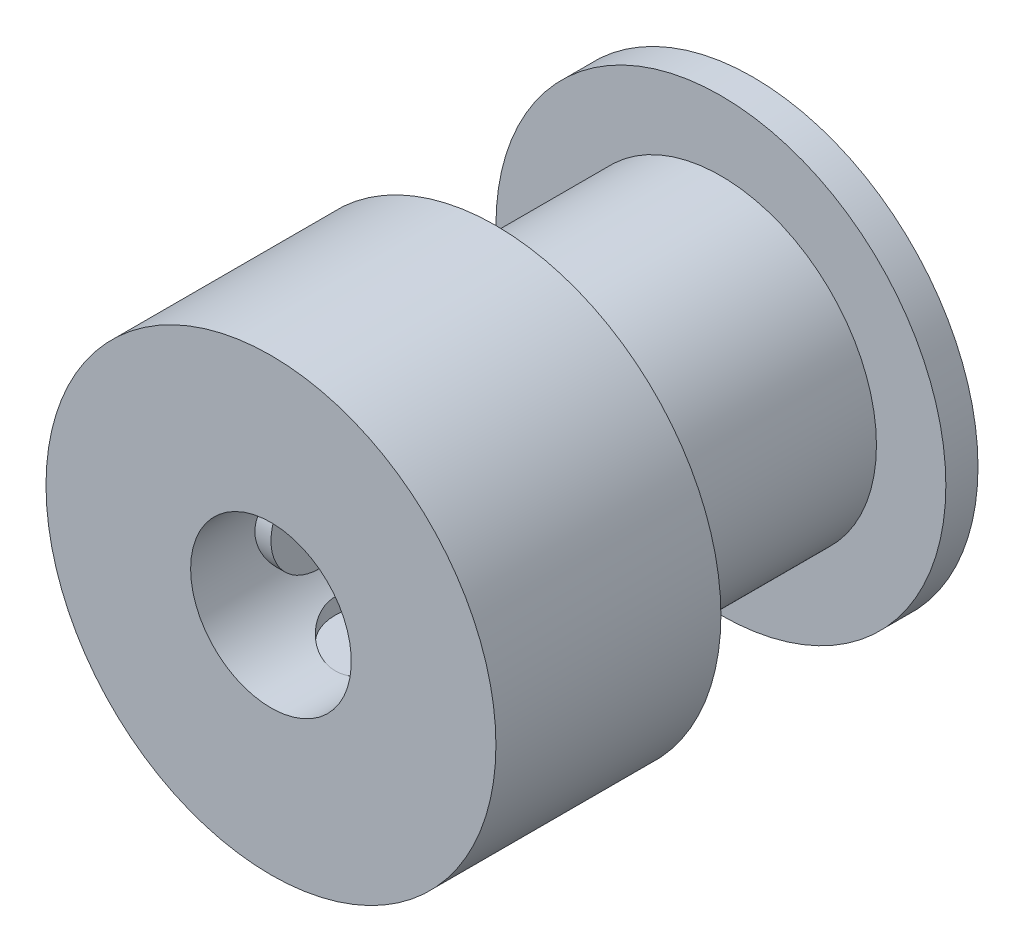
ISO-10303-21;
HEADER;
FILE_DESCRIPTION(('STEP AP214'),'2;1');
FILE_NAME('part.step','',(''),(''),'','','');
FILE_SCHEMA(('AUTOMOTIVE_DESIGN { 1 0 10303 214 1 1 1 1 }'));
ENDSEC;
DATA;
#1=APPLICATION_CONTEXT('core data for automotive mechanical design processes');
#2=APPLICATION_PROTOCOL_DEFINITION('international standard','automotive_design',2000,#1);
#3=PRODUCT_CONTEXT('',#1,'mechanical');
#4=PRODUCT('Part','Part','',(#3));
#5=PRODUCT_RELATED_PRODUCT_CATEGORY('part','',(#4));
#6=PRODUCT_DEFINITION_FORMATION('','',#4);
#7=PRODUCT_DEFINITION_CONTEXT('part definition',#1,'design');
#8=PRODUCT_DEFINITION('design','',#6,#7);
#9=PRODUCT_DEFINITION_SHAPE('','',#8);
#10=(LENGTH_UNIT() NAMED_UNIT(*) SI_UNIT(.MILLI.,.METRE.));
#11=(NAMED_UNIT(*) PLANE_ANGLE_UNIT() SI_UNIT($,.RADIAN.));
#12=(NAMED_UNIT(*) SI_UNIT($,.STERADIAN.) SOLID_ANGLE_UNIT());
#13=UNCERTAINTY_MEASURE_WITH_UNIT(LENGTH_MEASURE(1.E-05),#10,'distance_accuracy_value','');
#14=(GEOMETRIC_REPRESENTATION_CONTEXT(3) GLOBAL_UNCERTAINTY_ASSIGNED_CONTEXT((#13)) GLOBAL_UNIT_ASSIGNED_CONTEXT((#10,
#11,#12)) REPRESENTATION_CONTEXT('',''));
#15=CARTESIAN_POINT('',(0.,0.,0.));
#16=DIRECTION('',(0.,0.,1.));
#17=DIRECTION('',(1.,0.,0.));
#18=AXIS2_PLACEMENT_3D('',#15,#16,#17);
#19=CARTESIAN_POINT('',(-2.,0.,10.5));
#20=DIRECTION('',(1.,0.,0.));
#21=DIRECTION('',(0.,0.,-1.));
#22=AXIS2_PLACEMENT_3D('',#19,#20,#21);
#23=PLANE('',#22);
#24=CARTESIAN_POINT('',(-2.,0.,10.5));
#25=DIRECTION('',(-1.,0.,0.));
#26=DIRECTION('',(0.,0.,1.));
#27=AXIS2_PLACEMENT_3D('',#24,#25,#26);
#28=CIRCLE('',#27,1.5);
#29=CARTESIAN_POINT('',(-2.,1.5,10.5));
#30=VERTEX_POINT('',#29);
#31=CARTESIAN_POINT('',(-2.,-1.5,10.5));
#32=VERTEX_POINT('',#31);
#33=EDGE_CURVE('E51',#30,#32,#28,.T.);
#34=ORIENTED_EDGE('',*,*,#33,.F.);
#35=CARTESIAN_POINT('',(-2.,0.,10.5));
#36=DIRECTION('',(-1.,0.,0.));
#37=DIRECTION('',(0.,0.,1.));
#38=AXIS2_PLACEMENT_3D('',#35,#36,#37);
#39=CIRCLE('',#38,1.5);
#40=EDGE_CURVE('E42',#32,#30,#39,.T.);
#41=ORIENTED_EDGE('',*,*,#40,.F.);
#42=EDGE_LOOP('',(#34,#41));
#43=FACE_BOUND('',#42,.T.);
#44=ADVANCED_FACE('F16',(#43),#23,.T.);
#45=CARTESIAN_POINT('',(0.,-2.5,10.5));
#46=DIRECTION('',(0.,1.,0.));
#47=DIRECTION('',(0.,0.,1.));
#48=AXIS2_PLACEMENT_3D('',#45,#46,#47);
#49=PLANE('',#48);
#50=CARTESIAN_POINT('',(0.,-2.5,10.5));
#51=DIRECTION('',(0.,-1.,0.));
#52=DIRECTION('',(0.,0.,-1.));
#53=AXIS2_PLACEMENT_3D('',#50,#51,#52);
#54=CIRCLE('',#53,1.5);
#55=CARTESIAN_POINT('',(0.,-2.5,9.));
#56=VERTEX_POINT('',#55);
#57=CARTESIAN_POINT('',(0.,-2.5,12.));
#58=VERTEX_POINT('',#57);
#59=EDGE_CURVE('E67',#56,#58,#54,.F.);
#60=ORIENTED_EDGE('',*,*,#59,.T.);
#61=CARTESIAN_POINT('',(0.,-2.5,10.5));
#62=DIRECTION('',(0.,-1.,0.));
#63=DIRECTION('',(0.,0.,-1.));
#64=AXIS2_PLACEMENT_3D('',#61,#62,#63);
#65=CIRCLE('',#64,1.5);
#66=EDGE_CURVE('E33',#58,#56,#65,.F.);
#67=ORIENTED_EDGE('',*,*,#66,.T.);
#68=EDGE_LOOP('',(#60,#67));
#69=FACE_BOUND('',#68,.T.);
#70=ADVANCED_FACE('F184',(#69),#49,.T.);
#71=CARTESIAN_POINT('',(0.,0.,0.));
#72=DIRECTION('',(0.,0.,-1.));
#73=DIRECTION('',(-1.,0.,0.));
#74=AXIS2_PLACEMENT_3D('',#71,#72,#73);
#75=CYLINDRICAL_SURFACE('',#74,7.);
#76=CARTESIAN_POINT('',(0.,0.,0.));
#77=DIRECTION('',(0.,0.,-1.));
#78=DIRECTION('',(-1.,0.,0.));
#79=AXIS2_PLACEMENT_3D('',#76,#77,#78);
#80=CIRCLE('',#79,7.);
#81=CARTESIAN_POINT('',(-7.,0.,0.));
#82=VERTEX_POINT('',#81);
#83=EDGE_CURVE('E69',#82,#82,#80,.F.);
#84=ORIENTED_EDGE('',*,*,#83,.F.);
#85=EDGE_LOOP('',(#84));
#86=FACE_BOUND('',#85,.T.);
#87=CARTESIAN_POINT('',(0.,0.,-1.));
#88=DIRECTION('',(0.,0.,-1.));
#89=DIRECTION('',(-1.,0.,0.));
#90=AXIS2_PLACEMENT_3D('',#87,#88,#89);
#91=CIRCLE('',#90,7.);
#92=CARTESIAN_POINT('',(-7.,0.,-1.));
#93=VERTEX_POINT('',#92);
#94=EDGE_CURVE('E19',#93,#93,#91,.F.);
#95=ORIENTED_EDGE('',*,*,#94,.T.);
#96=EDGE_LOOP('',(#95));
#97=FACE_BOUND('',#96,.T.);
#98=ADVANCED_FACE('F190',(#86,#97),#75,.T.);
#99=CARTESIAN_POINT('',(0.,0.,-1.));
#100=DIRECTION('',(0.,0.,1.));
#101=DIRECTION('',(1.,0.,0.));
#102=AXIS2_PLACEMENT_3D('',#99,#100,#101);
#103=PLANE('',#102);
#104=CARTESIAN_POINT('',(0.,0.,-1.));
#105=DIRECTION('',(0.,0.,-1.));
#106=DIRECTION('',(-1.,0.,0.));
#107=AXIS2_PLACEMENT_3D('',#104,#105,#106);
#108=CIRCLE('',#107,2.5);
#109=CARTESIAN_POINT('',(-2.5,0.,-1.));
#110=VERTEX_POINT('',#109);
#111=EDGE_CURVE('E59',#110,#110,#108,.F.);
#112=ORIENTED_EDGE('',*,*,#111,.T.);
#113=EDGE_LOOP('',(#112));
#114=FACE_BOUND('',#113,.T.);
#115=ORIENTED_EDGE('',*,*,#94,.F.);
#116=EDGE_LOOP('',(#115));
#117=FACE_BOUND('',#116,.T.);
#118=ADVANCED_FACE('F124',(#114,#117),#103,.F.);
#119=CARTESIAN_POINT('',(-2.,0.,10.5));
#120=DIRECTION('',(-1.,0.,0.));
#121=DIRECTION('',(0.,0.,1.));
#122=AXIS2_PLACEMENT_3D('',#119,#120,#121);
#123=CYLINDRICAL_SURFACE('',#122,1.5);
#124=ORIENTED_EDGE('',*,*,#40,.T.);
#125=CARTESIAN_POINT('',(-2.,1.5,10.5));
#126=CARTESIAN_POINT('',(-1.99998845125754,1.50000446667744,10.5379460039268));
#127=CARTESIAN_POINT('',(-2.00108119692007,1.49855919883946,10.5758677773118));
#128=CARTESIAN_POINT('',(-2.00536653048947,1.49282452671711,10.6513400826957));
#129=CARTESIAN_POINT('',(-2.00855707146071,1.48853789487668,10.6888909404004));
#130=CARTESIAN_POINT('',(-2.021041861003,1.47159501359917,10.7999561422818));
#131=CARTESIAN_POINT('',(-2.03325318506055,1.45485351717748,10.8725638438879));
#132=CARTESIAN_POINT('',(-2.06360790212355,1.41145584078444,11.0130266902596));
#133=CARTESIAN_POINT('',(-2.08173054369951,1.38483429988201,11.0808974663382));
#134=CARTESIAN_POINT('',(-2.12181561260657,1.32259985689998,11.2113100693901));
#135=CARTESIAN_POINT('',(-2.1437866991849,1.28696659587043,11.2738393954242));
#136=CARTESIAN_POINT('',(-2.192290190828,1.20270550742176,11.3999612476482));
#137=CARTESIAN_POINT('',(-2.21905257384834,1.15302554256959,11.4627620757373));
#138=CARTESIAN_POINT('',(-2.27227107730584,1.0442481916894,11.5797824496055));
#139=CARTESIAN_POINT('',(-2.29872706388119,0.98514684454674,11.6339983667583));
#140=CARTESIAN_POINT('',(-2.3517610005987,0.85142993599944,11.7381442725309));
#141=CARTESIAN_POINT('',(-2.37804133446304,0.775827124792299,11.7869727006281));
#142=CARTESIAN_POINT('',(-2.42444579119999,0.615617265743277,11.870823864095));
#143=CARTESIAN_POINT('',(-2.44457789911104,0.531022091045724,11.9058645236135));
#144=CARTESIAN_POINT('',(-2.47318791582301,0.372230873686335,11.9549816818827));
#145=CARTESIAN_POINT('',(-2.48315914915458,0.299144772998754,11.9717874821598));
#146=CARTESIAN_POINT('',(-2.49656321721301,0.150705389453477,11.9942932386834));
#147=CARTESIAN_POINT('',(-2.50000002526346,0.0753535126602901,11.9999999438957));
#148=CARTESIAN_POINT('',(-2.49999997422529,-0.0768784187058445,12.0000000572397));
#149=CARTESIAN_POINT('',(-2.49642260737716,-0.153758540157806,11.9940601609289));
#150=CARTESIAN_POINT('',(-2.48247690155861,-0.3051092913513,11.9706388656357));
#151=CARTESIAN_POINT('',(-2.47210567311113,-0.379578881728542,11.9531525558571));
#152=CARTESIAN_POINT('',(-2.44561848130593,-0.523742310889763,11.9076184726104));
#153=CARTESIAN_POINT('',(-2.4295262454606,-0.593454478249208,11.8796142946455));
#154=CARTESIAN_POINT('',(-2.39296178151658,-0.7270034849347,11.8141545835679));
#155=CARTESIAN_POINT('',(-2.37248889496281,-0.790839438942532,11.7766976294575));
#156=CARTESIAN_POINT('',(-2.32705598928082,-0.916293178478416,11.6902295623077));
#157=CARTESIAN_POINT('',(-2.30187299625839,-0.977371899925503,11.6405558174714));
#158=CARTESIAN_POINT('',(-2.25030967943651,-1.09087201913285,11.5325449898214));
#159=CARTESIAN_POINT('',(-2.22392762543903,-1.14328036546564,11.4741950931026));
#160=CARTESIAN_POINT('',(-2.16908607213643,-1.24449562751425,11.3420151528547));
#161=CARTESIAN_POINT('',(-2.14077220513037,-1.29205912552267,11.2671633239585));
#162=CARTESIAN_POINT('',(-2.08934323302114,-1.37367216768323,11.1090186561716));
#163=CARTESIAN_POINT('',(-2.06621114513034,-1.40776614604833,11.0257547288919));
#164=CARTESIAN_POINT('',(-2.03267374057175,-1.45565431453618,10.8693086875281));
#165=CARTESIAN_POINT('',(-2.02067077842903,-1.47210209140112,10.7972999951129));
#166=CARTESIAN_POINT('',(-2.00840393817101,-1.48874396466246,10.6871882329893));
#167=CARTESIAN_POINT('',(-2.00527035572197,-1.49295348428562,10.6499743095207));
#168=CARTESIAN_POINT('',(-2.00106149599344,-1.49858543052732,10.5751810330064));
#169=CARTESIAN_POINT('',(-1.99998845565003,-1.50000482821327,10.5376013272806));
#170=CARTESIAN_POINT('',(-2.,-1.5,10.5));
#171=B_SPLINE_CURVE_WITH_KNOTS('',3,(#125,#126,#127,#128,#129,#130,#131,#132,#133,#134,#135,
#136,#137,#138,#139,#140,#141,#142,#143,#144,#145,#146,#147,#148,#149,#150,#151,#152,#153,#154,
#155,#156,#157,#158,#159,#160,#161,#162,#163,#164,#165,#166,#167,#168,#169,#170),.UNSPECIFIED.,
.F.,.F.,(4,2,2,2,2,2,2,2,2,2,2,2,2,2,2,2,2,2,2,2,2,2,4),(0.,0.113749743967779,0.227388660366983,
0.452655846808962,0.677140603024991,0.902137109468504,1.1544356933506,1.40684063448354,
1.68660467371304,1.96600380749074,2.1919096879361,2.41767816003353,2.64801543981945,
2.87845074732742,3.10794127960443,3.33746633083744,3.58446927615064,3.83184071452131,
4.10975199652156,4.3867386726253,4.61004515803665,4.7226449405358,4.83536689303875),.UNSPECIFIED.);
#172=EDGE_CURVE('E54',#30,#32,#171,.T.);
#173=ORIENTED_EDGE('',*,*,#172,.T.);
#174=EDGE_LOOP('',(#124,#173));
#175=FACE_BOUND('',#174,.T.);
#176=ADVANCED_FACE('F62',(#175),#123,.T.);
#177=CARTESIAN_POINT('',(-2.,0.,10.5));
#178=DIRECTION('',(-1.,0.,0.));
#179=DIRECTION('',(0.,0.,1.));
#180=AXIS2_PLACEMENT_3D('',#177,#178,#179);
#181=CYLINDRICAL_SURFACE('',#180,1.5);
#182=ORIENTED_EDGE('',*,*,#33,.T.);
#183=CARTESIAN_POINT('',(-2.,-1.5,10.5));
#184=CARTESIAN_POINT('',(-1.99998845125754,-1.50000446667744,10.4620539960732));
#185=CARTESIAN_POINT('',(-2.00108119692007,-1.49855919883946,10.4241322226882));
#186=CARTESIAN_POINT('',(-2.00536653048948,-1.49282452671711,10.3486599173043));
#187=CARTESIAN_POINT('',(-2.00855707146071,-1.48853789487668,10.3111090595996));
#188=CARTESIAN_POINT('',(-2.021041861003,-1.47159501359917,10.2000438577182));
#189=CARTESIAN_POINT('',(-2.03325318506055,-1.45485351717748,10.1274361561121));
#190=CARTESIAN_POINT('',(-2.06360790212355,-1.41145584078444,9.98697330974039));
#191=CARTESIAN_POINT('',(-2.08173054369951,-1.38483429988201,9.91910253366179));
#192=CARTESIAN_POINT('',(-2.12181561260657,-1.32259985689998,9.78868993060992));
#193=CARTESIAN_POINT('',(-2.14378669918491,-1.28696659587042,9.72616060457585));
#194=CARTESIAN_POINT('',(-2.192290190828,-1.20270550742175,9.60003875235176));
#195=CARTESIAN_POINT('',(-2.21905257384835,-1.15302554256959,9.53723792426272));
#196=CARTESIAN_POINT('',(-2.27227107730584,-1.0442481916894,9.42021755039451));
#197=CARTESIAN_POINT('',(-2.29872706388119,-0.985146844546733,9.36600163324166));
#198=CARTESIAN_POINT('',(-2.3517610005987,-0.851429935999432,9.26185572746905));
#199=CARTESIAN_POINT('',(-2.37804133446305,-0.775827124792291,9.21302729937186));
#200=CARTESIAN_POINT('',(-2.42444579119999,-0.615617265743269,9.12917613590496));
#201=CARTESIAN_POINT('',(-2.44457789911104,-0.531022091045715,9.09413547638651));
#202=CARTESIAN_POINT('',(-2.47318791582301,-0.372230873686328,9.04501831811731));
#203=CARTESIAN_POINT('',(-2.48315914915458,-0.299144772998749,9.02821251784016));
#204=CARTESIAN_POINT('',(-2.49656321721301,-0.150705389453474,9.00570676131658));
#205=CARTESIAN_POINT('',(-2.50000002526346,-0.0753535126602886,9.00000005610433));
#206=CARTESIAN_POINT('',(-2.49999997422529,0.0768784187058447,8.9999999427603));
#207=CARTESIAN_POINT('',(-2.49642260737716,0.153758540157806,9.00593983907108));
#208=CARTESIAN_POINT('',(-2.48247690155861,0.3051092913513,9.02936113436433));
#209=CARTESIAN_POINT('',(-2.47210567311113,0.379578881728543,9.04684744414288));
#210=CARTESIAN_POINT('',(-2.44561848130593,0.523742310889763,9.09238152738961));
#211=CARTESIAN_POINT('',(-2.4295262454606,0.593454478249208,9.1203857053545));
#212=CARTESIAN_POINT('',(-2.39296178151658,0.727003484934701,9.18584541643214));
#213=CARTESIAN_POINT('',(-2.37248889496281,0.790839438942532,9.22330237054254));
#214=CARTESIAN_POINT('',(-2.32705598928082,0.916293178478416,9.30977043769226));
#215=CARTESIAN_POINT('',(-2.30187299625839,0.977371899925503,9.35944418252859));
#216=CARTESIAN_POINT('',(-2.25030967943651,1.09087201913285,9.4674550101786));
#217=CARTESIAN_POINT('',(-2.22392762543903,1.14328036546564,9.52580490689743));
#218=CARTESIAN_POINT('',(-2.16908607213643,1.24449562751425,9.65798484714533));
#219=CARTESIAN_POINT('',(-2.14077220513037,1.29205912552267,9.73283667604147));
#220=CARTESIAN_POINT('',(-2.08934323302114,1.37367216768323,9.89098134382835));
#221=CARTESIAN_POINT('',(-2.06621114513034,1.40776614604833,9.97424527110812));
#222=CARTESIAN_POINT('',(-2.03267374057175,1.45565431453618,10.1306913124719));
#223=CARTESIAN_POINT('',(-2.02067077842902,1.47210209140112,10.2027000048871));
#224=CARTESIAN_POINT('',(-2.008403938171,1.48874396466246,10.3128117670107));
#225=CARTESIAN_POINT('',(-2.00527035572197,1.49295348428562,10.3500256904793));
#226=CARTESIAN_POINT('',(-2.00106149599343,1.49858543052732,10.4248189669936));
#227=CARTESIAN_POINT('',(-1.99998845565003,1.50000482821327,10.4623986727194));
#228=CARTESIAN_POINT('',(-2.,1.5,10.5));
#229=B_SPLINE_CURVE_WITH_KNOTS('',3,(#183,#184,#185,#186,#187,#188,#189,#190,#191,#192,#193,
#194,#195,#196,#197,#198,#199,#200,#201,#202,#203,#204,#205,#206,#207,#208,#209,#210,#211,#212,
#213,#214,#215,#216,#217,#218,#219,#220,#221,#222,#223,#224,#225,#226,#227,#228),.UNSPECIFIED.,
.F.,.F.,(4,2,2,2,2,2,2,2,2,2,2,2,2,2,2,2,2,2,2,2,2,2,4),(0.,0.113749743967779,0.227388660366983,
0.452655846808964,0.677140603024995,0.902137109468504,1.1544356933506,1.40684063448355,
1.68660467371305,1.96600380749074,2.1919096879361,2.41767816003353,2.64801543981945,
2.87845074732741,3.10794127960442,3.33746633083743,3.58446927615064,3.8318407145213,
4.10975199652156,4.3867386726253,4.61004515803664,4.72264494053579,4.83536689303875),.UNSPECIFIED.);
#230=EDGE_CURVE('E48',#32,#30,#229,.T.);
#231=ORIENTED_EDGE('',*,*,#230,.T.);
#232=EDGE_LOOP('',(#182,#231));
#233=FACE_BOUND('',#232,.T.);
#234=ADVANCED_FACE('F50',(#233),#181,.T.);
#235=CARTESIAN_POINT('',(0.,0.,10.5));
#236=DIRECTION('',(0.,-1.,0.));
#237=DIRECTION('',(0.,0.,-1.));
#238=AXIS2_PLACEMENT_3D('',#235,#236,#237);
#239=CYLINDRICAL_SURFACE('',#238,1.5);
#240=CARTESIAN_POINT('',(0.,-2.5,12.));
#241=CARTESIAN_POINT('',(0.0385814004818395,-2.50000443930784,12.0000027845304));
#242=CARTESIAN_POINT('',(0.0771415674825014,-2.49910594610235,11.9985104087853));
#243=CARTESIAN_POINT('',(0.153933720325979,-2.49555162123921,11.9925770543666));
#244=CARTESIAN_POINT('',(0.192165861924006,-2.49289667640063,11.9881375636652));
#245=CARTESIAN_POINT('',(0.305515608465147,-2.48241334520944,11.9705339725033));
#246=CARTESIAN_POINT('',(0.379786208449342,-2.47206515182342,11.9530835051044));
#247=CARTESIAN_POINT('',(0.523717422888231,-2.4456254792361,11.9076298943821));
#248=CARTESIAN_POINT('',(0.593385129935151,-2.42954309263498,11.8796434538469));
#249=CARTESIAN_POINT('',(0.726933408093366,-2.3929831093628,11.8141937663116));
#250=CARTESIAN_POINT('',(0.790806982564217,-2.37250029690152,11.7767192636934));
#251=CARTESIAN_POINT('',(0.916306643350074,-2.32705149177753,11.6902210736182));
#252=CARTESIAN_POINT('',(0.977395457980456,-2.30186337045005,11.6405373135232));
#253=CARTESIAN_POINT('',(1.09089176245313,-2.25029963049995,11.5325222779886));
#254=CARTESIAN_POINT('',(1.1432895329452,-2.22392272378701,11.4741814574582));
#255=CARTESIAN_POINT('',(1.24445033696731,-2.16911053833429,11.3420761668166));
#256=CARTESIAN_POINT('',(1.29197814210969,-2.14081991172111,11.2672975272364));
#257=CARTESIAN_POINT('',(1.37361466763903,-2.08938279472069,11.1091526412274));
#258=CARTESIAN_POINT('',(1.40774529078447,-2.06622793517034,11.0258006951094));
#259=CARTESIAN_POINT('',(1.45440588845967,-2.03354639077354,10.873403988671));
#260=CARTESIAN_POINT('',(1.47016176402116,-2.02207898388904,10.8057649058051));
#261=CARTESIAN_POINT('',(1.49216163757828,-2.00590314688703,10.6681972185815));
#262=CARTESIAN_POINT('',(1.49841733576744,-2.00118640322559,10.5982715389981));
#263=CARTESIAN_POINT('',(1.50105509186428,-1.99920922227166,10.457988351739));
#264=CARTESIAN_POINT('',(1.49741781983876,-2.0019633823942,10.3876302670482));
#265=CARTESIAN_POINT('',(1.48046054476459,-2.01453265724005,10.2487209243655));
#266=CARTESIAN_POINT('',(1.46713330077918,-2.0243530522272,10.1801710573029));
#267=CARTESIAN_POINT('',(1.43173915740478,-2.04953191748151,10.0474695044733));
#268=CARTESIAN_POINT('',(1.40978734105081,-2.06481723350102,9.9832724537562));
#269=CARTESIAN_POINT('',(1.35795036175845,-2.09927066338523,9.85930454120239));
#270=CARTESIAN_POINT('',(1.32806235171397,-2.11844017011581,9.79953527769404));
#271=CARTESIAN_POINT('',(1.25518104106243,-2.16255259931458,9.67501780611045));
#272=CARTESIAN_POINT('',(1.21081016017397,-2.1879189881197,9.61122555972334));
#273=CARTESIAN_POINT('',(1.11291350322468,-2.23930456094727,9.49132658913887));
#274=CARTESIAN_POINT('',(1.05937846722628,-2.26532438231465,9.43522774304631));
#275=CARTESIAN_POINT('',(0.935803921168373,-2.31935920842897,9.32437859536777));
#276=CARTESIAN_POINT('',(0.864503841812061,-2.34714618785512,9.27090811709965));
#277=CARTESIAN_POINT('',(0.712244675848714,-2.39773148732483,9.17686459052258));
#278=CARTESIAN_POINT('',(0.631293671068314,-2.42053393676571,9.13628085357353));
#279=CARTESIAN_POINT('',(0.478302472498103,-2.45481960299191,9.07640815930277));
#280=CARTESIAN_POINT('',(0.407574199222196,-2.46763989045195,9.0545169216726));
#281=CARTESIAN_POINT('',(0.262934036845264,-2.48719803445021,9.0213731562986));
#282=CARTESIAN_POINT('',(0.189030327299971,-2.49395063949223,9.01009482895284));
#283=CARTESIAN_POINT('',(0.0955848699627537,-2.4982460622018,9.00292517605478));
#284=CARTESIAN_POINT('',(0.0764812683724458,-2.49890352611496,9.0018282580862));
#285=CARTESIAN_POINT('',(0.0382541496932987,-2.49977987940585,9.0003665802204));
#286=CARTESIAN_POINT('',(0.0191306686226404,-2.49999918372609,9.00000112761591));
#287=CARTESIAN_POINT('',(0.,-2.5,9.));
#288=B_SPLINE_CURVE_WITH_KNOTS('',3,(#240,#241,#242,#243,#244,#245,#246,#247,#248,#249,#250,
#251,#252,#253,#254,#255,#256,#257,#258,#259,#260,#261,#262,#263,#264,#265,#266,#267,#268,#269,
#270,#271,#272,#273,#274,#275,#276,#277,#278,#279,#280,#281,#282,#283,#284,#285,#286,#287),
.UNSPECIFIED.,.F.,.F.,(4,2,2,2,2,2,2,2,2,2,2,2,2,2,2,2,2,2,2,2,2,2,2,4),(0.,0.115664120203099,
0.231269886993216,0.461003678278137,0.690374793435717,0.920019295308534,1.1670692627372,
1.4143936745253,1.69207052751252,1.96929150285475,2.17956799484947,2.38958530467528,
2.60001326320508,2.81059862813213,3.01846457428349,3.22640519324175,3.47069421075596,
3.71523154357855,3.99388188884002,4.27230050596577,4.49678090538653,4.72071418048355,
4.77814150578977,4.83551442088689),.UNSPECIFIED.);
#289=EDGE_CURVE('E53',#58,#56,#288,.T.);
#290=ORIENTED_EDGE('',*,*,#289,.T.);
#291=ORIENTED_EDGE('',*,*,#66,.F.);
#292=EDGE_LOOP('',(#290,#291));
#293=FACE_BOUND('',#292,.T.);
#294=ADVANCED_FACE('F112',(#293),#239,.F.);
#295=CARTESIAN_POINT('',(0.,0.,10.5));
#296=DIRECTION('',(0.,-1.,0.));
#297=DIRECTION('',(0.,0.,-1.));
#298=AXIS2_PLACEMENT_3D('',#295,#296,#297);
#299=CYLINDRICAL_SURFACE('',#298,1.5);
#300=CARTESIAN_POINT('',(0.,-2.5,9.));
#301=CARTESIAN_POINT('',(-0.0385813837962223,-2.50000443929168,8.99999721523212));
#302=CARTESIAN_POINT('',(-0.0771415341276934,-2.49910594687359,9.00148958980402));
#303=CARTESIAN_POINT('',(-0.153933653988488,-2.49555162508018,9.00742293934229));
#304=CARTESIAN_POINT('',(-0.192165779273228,-2.49289668252548,9.01186242633403));
#305=CARTESIAN_POINT('',(-0.305515543660832,-2.4824133541699,9.02946601180464));
#306=CARTESIAN_POINT('',(-0.379786176961611,-2.47206515751797,9.04691648247312));
#307=CARTESIAN_POINT('',(-0.523717183771282,-2.44562552325056,9.09237003257928));
#308=CARTESIAN_POINT('',(-0.593384666741939,-2.42954319986203,9.12035636948615));
#309=CARTESIAN_POINT('',(-0.726932980022347,-2.39298324615722,9.18580597349381));
#310=CARTESIAN_POINT('',(-0.790806774613754,-2.37250037091411,9.22328055904044));
#311=CARTESIAN_POINT('',(-0.916308038511827,-2.32705098792305,9.30977992448331));
#312=CARTESIAN_POINT('',(-0.977398091852476,-2.30186229088331,9.35946496676965));
#313=CARTESIAN_POINT('',(-1.090893982525,-2.25029850457702,9.46748006169127));
#314=CARTESIAN_POINT('',(-1.14329047376486,-2.22392217676002,9.52581929214197));
#315=CARTESIAN_POINT('',(-1.24444354364624,-2.1691142610035,9.6579154995646));
#316=CARTESIAN_POINT('',(-1.29196626366659,-2.1408271668036,9.73268581241023));
#317=CARTESIAN_POINT('',(-1.37360546118757,-2.08938882848929,9.8908231957338));
#318=CARTESIAN_POINT('',(-1.40774041421672,-2.06623052584855,9.97417821691156));
#319=CARTESIAN_POINT('',(-1.45575429980654,-2.03260261763291,10.1310041911241));
#320=CARTESIAN_POINT('',(-1.47225551749514,-2.02055502127791,10.2033261900206));
#321=CARTESIAN_POINT('',(-1.49437060305173,-2.0042591896918,10.3504345197357));
#322=CARTESIAN_POINT('',(-1.49999988711658,-1.99999991122979,10.4252172079751));
#323=CARTESIAN_POINT('',(-1.50000011391186,-2.00000008957896,10.5754641090421));
#324=CARTESIAN_POINT('',(-1.49426801901149,-2.00433751081761,10.6509283237693));
#325=CARTESIAN_POINT('',(-1.47175227371235,-2.02092317633736,10.799320108909));
#326=CARTESIAN_POINT('',(-1.45495605813505,-2.03318041460597,10.872244695889));
#327=CARTESIAN_POINT('',(-1.41143492667642,-2.06362357074115,11.0130817328375));
#328=CARTESIAN_POINT('',(-1.38478231401582,-2.08176619919683,11.0810264686901));
#329=CARTESIAN_POINT('',(-1.32253029758288,-2.12185824141449,11.2114356889974));
#330=CARTESIAN_POINT('',(-1.28692794273441,-2.14380891009333,11.2738983566185));
#331=CARTESIAN_POINT('',(-1.20271467347221,-2.19228495845041,11.3999462876053));
#332=CARTESIAN_POINT('',(-1.15304573264917,-2.2190415774584,11.4627359060435));
#333=CARTESIAN_POINT('',(-1.04427276281273,-2.27226017558418,11.5797604675685));
#334=CARTESIAN_POINT('',(-0.985160917119809,-2.29872189100128,11.6339882487119));
#335=CARTESIAN_POINT('',(-0.851396120389797,-2.35177395943889,11.7381696759581));
#336=CARTESIAN_POINT('',(-0.77575234996935,-2.37806573960125,11.7870182924309));
#337=CARTESIAN_POINT('',(-0.615542596594062,-2.4244646856954,11.8708565130722));
#338=CARTESIAN_POINT('',(-0.530996901072252,-2.4445855222223,11.9058768016189));
#339=CARTESIAN_POINT('',(-0.372427026232439,-2.47315008647313,11.954917389803));
#340=CARTESIAN_POINT('',(-0.299531645990906,-2.48309981307425,11.971689657388));
#341=CARTESIAN_POINT('',(-0.188352869739565,-2.49317576696373,11.9886047299581));
#342=CARTESIAN_POINT('',(-0.150874224877934,-2.49572659946414,11.9928694755803));
#343=CARTESIAN_POINT('',(-0.0756031337597444,-2.49914156814389,11.9985696443564));
#344=CARTESIAN_POINT('',(-0.0378105073089931,-2.50000465731207,12.0000033112231));
#345=CARTESIAN_POINT('',(0.,-2.5,12.));
#346=B_SPLINE_CURVE_WITH_KNOTS('',3,(#300,#301,#302,#303,#304,#305,#306,#307,#308,#309,#310,
#311,#312,#313,#314,#315,#316,#317,#318,#319,#320,#321,#322,#323,#324,#325,#326,#327,#328,#329,
#330,#331,#332,#333,#334,#335,#336,#337,#338,#339,#340,#341,#342,#343,#344,#345),.UNSPECIFIED.,
.F.,.F.,(4,2,2,2,2,2,2,2,2,2,2,2,2,2,2,2,2,2,2,2,2,2,4),(0.,0.115664070226622,0.231269786914254,
0.4610036780022,0.690374029801941,0.920019295244452,1.16707453371946,1.41439367395422,
1.69203483457204,1.96929148222114,2.19364345424009,2.41767706514676,2.64375175940176,
2.87008364333738,3.09478714246972,3.31956483244903,3.57181164511697,3.82426835594318,
4.10416227812526,4.38343159161057,4.60867322251853,4.72196326217573,4.83532356035488),.UNSPECIFIED.);
#347=EDGE_CURVE('E101',#56,#58,#346,.T.);
#348=ORIENTED_EDGE('',*,*,#347,.T.);
#349=ORIENTED_EDGE('',*,*,#59,.F.);
#350=EDGE_LOOP('',(#348,#349));
#351=FACE_BOUND('',#350,.T.);
#352=ADVANCED_FACE('F115',(#351),#299,.F.);
#353=CARTESIAN_POINT('',(0.,0.,0.));
#354=DIRECTION('',(0.,0.,1.));
#355=DIRECTION('',(1.,0.,0.));
#356=AXIS2_PLACEMENT_3D('',#353,#354,#355);
#357=PLANE('',#356);
#358=CARTESIAN_POINT('',(0.,0.,0.));
#359=DIRECTION('',(0.,0.,1.));
#360=DIRECTION('',(1.,0.,0.));
#361=AXIS2_PLACEMENT_3D('',#358,#359,#360);
#362=CIRCLE('',#361,4.84);
#363=CARTESIAN_POINT('',(4.84,0.,0.));
#364=VERTEX_POINT('',#363);
#365=EDGE_CURVE('E174',#364,#364,#362,.T.);
#366=ORIENTED_EDGE('',*,*,#365,.F.);
#367=EDGE_LOOP('',(#366));
#368=FACE_BOUND('',#367,.T.);
#369=ORIENTED_EDGE('',*,*,#83,.T.);
#370=EDGE_LOOP('',(#369));
#371=FACE_BOUND('',#370,.T.);
#372=ADVANCED_FACE('F94',(#368,#371),#357,.T.);
#373=CARTESIAN_POINT('',(0.,0.,0.));
#374=DIRECTION('',(0.,0.,-1.));
#375=DIRECTION('',(-1.,0.,0.));
#376=AXIS2_PLACEMENT_3D('',#373,#374,#375);
#377=CYLINDRICAL_SURFACE('',#376,2.5);
#378=ORIENTED_EDGE('',*,*,#172,.F.);
#379=ORIENTED_EDGE('',*,*,#230,.F.);
#380=EDGE_LOOP('',(#378,#379));
#381=FACE_BOUND('',#380,.T.);
#382=CARTESIAN_POINT('',(0.,0.,14.));
#383=DIRECTION('',(0.,0.,-1.));
#384=DIRECTION('',(-1.,0.,0.));
#385=AXIS2_PLACEMENT_3D('',#382,#383,#384);
#386=CIRCLE('',#385,2.5);
#387=CARTESIAN_POINT('',(-2.5,0.,14.));
#388=VERTEX_POINT('',#387);
#389=EDGE_CURVE('E172',#388,#388,#386,.T.);
#390=ORIENTED_EDGE('',*,*,#389,.F.);
#391=EDGE_LOOP('',(#390));
#392=FACE_BOUND('',#391,.T.);
#393=ORIENTED_EDGE('',*,*,#289,.F.);
#394=ORIENTED_EDGE('',*,*,#347,.F.);
#395=EDGE_LOOP('',(#393,#394));
#396=FACE_BOUND('',#395,.T.);
#397=ORIENTED_EDGE('',*,*,#111,.F.);
#398=EDGE_LOOP('',(#397));
#399=FACE_BOUND('',#398,.T.);
#400=ADVANCED_FACE('F56',(#381,#392,#396,#399),#377,.F.);
#401=CARTESIAN_POINT('',(0.,0.,0.));
#402=DIRECTION('',(0.,0.,1.));
#403=DIRECTION('',(1.,0.,0.));
#404=AXIS2_PLACEMENT_3D('',#401,#402,#403);
#405=CYLINDRICAL_SURFACE('',#404,4.84);
#406=ORIENTED_EDGE('',*,*,#365,.T.);
#407=EDGE_LOOP('',(#406));
#408=FACE_BOUND('',#407,.T.);
#409=CARTESIAN_POINT('',(0.,0.,7.));
#410=DIRECTION('',(0.,0.,1.));
#411=DIRECTION('',(1.,0.,0.));
#412=AXIS2_PLACEMENT_3D('',#409,#410,#411);
#413=CIRCLE('',#412,4.84);
#414=CARTESIAN_POINT('',(4.84,0.,7.));
#415=VERTEX_POINT('',#414);
#416=EDGE_CURVE('E169',#415,#415,#413,.F.);
#417=ORIENTED_EDGE('',*,*,#416,.T.);
#418=EDGE_LOOP('',(#417));
#419=FACE_BOUND('',#418,.T.);
#420=ADVANCED_FACE('F93',(#408,#419),#405,.T.);
#421=CARTESIAN_POINT('',(-6.5,0.,10.5));
#422=DIRECTION('',(1.,0.,0.));
#423=DIRECTION('',(0.,0.,-1.));
#424=AXIS2_PLACEMENT_3D('',#421,#422,#423);
#425=PLANE('',#424);
#426=CARTESIAN_POINT('',(-6.5,0.,10.5));
#427=DIRECTION('',(-1.,0.,0.));
#428=DIRECTION('',(0.,0.,1.));
#429=AXIS2_PLACEMENT_3D('',#426,#427,#428);
#430=CIRCLE('',#429,1.5);
#431=CARTESIAN_POINT('',(-6.5,0.,12.));
#432=VERTEX_POINT('',#431);
#433=EDGE_CURVE('E164',#432,#432,#430,.T.);
#434=ORIENTED_EDGE('',*,*,#433,.T.);
#435=EDGE_LOOP('',(#434));
#436=FACE_BOUND('',#435,.T.);
#437=ADVANCED_FACE('F299',(#436),#425,.F.);
#438=CARTESIAN_POINT('',(0.,-6.5,10.5));
#439=DIRECTION('',(0.,1.,0.));
#440=DIRECTION('',(0.,0.,1.));
#441=AXIS2_PLACEMENT_3D('',#438,#439,#440);
#442=PLANE('',#441);
#443=CARTESIAN_POINT('',(0.,-6.5,10.5));
#444=DIRECTION('',(0.,-1.,0.));
#445=DIRECTION('',(0.,0.,-1.));
#446=AXIS2_PLACEMENT_3D('',#443,#444,#445);
#447=CIRCLE('',#446,1.5);
#448=CARTESIAN_POINT('',(0.,-6.5,9.));
#449=VERTEX_POINT('',#448);
#450=EDGE_CURVE('E160',#449,#449,#447,.T.);
#451=ORIENTED_EDGE('',*,*,#450,.T.);
#452=EDGE_LOOP('',(#451));
#453=FACE_BOUND('',#452,.T.);
#454=ADVANCED_FACE('F310',(#453),#442,.F.);
#455=CARTESIAN_POINT('',(0.,0.,14.));
#456=DIRECTION('',(0.,0.,1.));
#457=DIRECTION('',(1.,0.,0.));
#458=AXIS2_PLACEMENT_3D('',#455,#456,#457);
#459=PLANE('',#458);
#460=ORIENTED_EDGE('',*,*,#389,.T.);
#461=EDGE_LOOP('',(#460));
#462=FACE_BOUND('',#461,.T.);
#463=CARTESIAN_POINT('',(0.,0.,14.));
#464=DIRECTION('',(0.,0.,1.));
#465=DIRECTION('',(1.,0.,0.));
#466=AXIS2_PLACEMENT_3D('',#463,#464,#465);
#467=CIRCLE('',#466,7.);
#468=CARTESIAN_POINT('',(7.,0.,14.));
#469=VERTEX_POINT('',#468);
#470=EDGE_CURVE('E157',#469,#469,#467,.F.);
#471=ORIENTED_EDGE('',*,*,#470,.F.);
#472=EDGE_LOOP('',(#471));
#473=FACE_BOUND('',#472,.T.);
#474=ADVANCED_FACE('F316',(#462,#473),#459,.T.);
#475=CARTESIAN_POINT('',(0.,0.,7.));
#476=DIRECTION('',(0.,0.,1.));
#477=DIRECTION('',(1.,0.,0.));
#478=AXIS2_PLACEMENT_3D('',#475,#476,#477);
#479=PLANE('',#478);
#480=ORIENTED_EDGE('',*,*,#416,.F.);
#481=EDGE_LOOP('',(#480));
#482=FACE_BOUND('',#481,.T.);
#483=CARTESIAN_POINT('',(0.,0.,7.));
#484=DIRECTION('',(0.,0.,1.));
#485=DIRECTION('',(1.,0.,0.));
#486=AXIS2_PLACEMENT_3D('',#483,#484,#485);
#487=CIRCLE('',#486,7.);
#488=CARTESIAN_POINT('',(7.,0.,7.));
#489=VERTEX_POINT('',#488);
#490=EDGE_CURVE('E25',#489,#489,#487,.T.);
#491=ORIENTED_EDGE('',*,*,#490,.F.);
#492=EDGE_LOOP('',(#491));
#493=FACE_BOUND('',#492,.T.);
#494=ADVANCED_FACE('F324',(#482,#493),#479,.F.);
#495=CARTESIAN_POINT('',(0.,0.,10.5));
#496=DIRECTION('',(-1.,0.,0.));
#497=DIRECTION('',(0.,0.,1.));
#498=AXIS2_PLACEMENT_3D('',#495,#496,#497);
#499=CYLINDRICAL_SURFACE('',#498,1.5);
#500=CARTESIAN_POINT('',(-7.,0.,12.));
#501=CARTESIAN_POINT('',(-6.99999791580753,-0.0831465590556463,11.9999959387895));
#502=CARTESIAN_POINT('',(-6.99850197998886,-0.166394901741794,11.9930566541991));
#503=CARTESIAN_POINT('',(-6.99267372377269,-0.33059858778918,11.9654898713311));
#504=CARTESIAN_POINT('',(-6.98833585987954,-0.411549126383735,11.9448356194201));
#505=CARTESIAN_POINT('',(-6.97730743490756,-0.568658697157827,11.8905113873844));
#506=CARTESIAN_POINT('',(-6.97062036051717,-0.644824634206284,11.8568606892157));
#507=CARTESIAN_POINT('',(-6.95561852695009,-0.790400241418421,11.7775518743461));
#508=CARTESIAN_POINT('',(-6.9473043222941,-0.859812201283441,11.7318978465253));
#509=CARTESIAN_POINT('',(-6.92981481882541,-0.991016080653161,11.6291265017606));
#510=CARTESIAN_POINT('',(-6.92062918324245,-1.05268906509165,11.5718590873229));
#511=CARTESIAN_POINT('',(-6.90250300768582,-1.16564734733281,11.4477902787444));
#512=CARTESIAN_POINT('',(-6.89356255276114,-1.21692907903126,11.3809856249439));
#513=CARTESIAN_POINT('',(-6.87683673624212,-1.30816573509505,11.2388591387936));
#514=CARTESIAN_POINT('',(-6.86906511662086,-1.34799028196395,11.1634519400034));
#515=CARTESIAN_POINT('',(-6.85571752099714,-1.41431700058393,11.0068721633176));
#516=CARTESIAN_POINT('',(-6.85013901485742,-1.44083453411203,10.9257063574033));
#517=CARTESIAN_POINT('',(-6.84317753573821,-1.47346322995202,10.7867653473395));
#518=CARTESIAN_POINT('',(-6.84102151679138,-1.48339848658806,10.7298974779827));
#519=CARTESIAN_POINT('',(-6.83813062992271,-1.49666804901388,10.6153610387792));
#520=CARTESIAN_POINT('',(-6.8373957262839,-1.50000252070153,10.5576924890925));
#521=CARTESIAN_POINT('',(-6.83739924103941,-1.49999636519521,10.4168085024319));
#522=CARTESIAN_POINT('',(-6.8389324020504,-1.49305408732151,10.3335672274075));
#523=CARTESIAN_POINT('',(-6.84489047395723,-1.46549141366155,10.1694332343614));
#524=CARTESIAN_POINT('',(-6.84931831840076,-1.44485714173269,10.0885429858833));
#525=CARTESIAN_POINT('',(-6.86054142533327,-1.39058741240403,9.93153140808865));
#526=CARTESIAN_POINT('',(-6.86733392874886,-1.35696710206957,9.85540464235798));
#527=CARTESIAN_POINT('',(-6.88251743209168,-1.27772216951022,9.70987850690768));
#528=CARTESIAN_POINT('',(-6.89090824633907,-1.23209894146039,9.64047835715163));
#529=CARTESIAN_POINT('',(-6.90849484787436,-1.12935709357421,9.50924414330792));
#530=CARTESIAN_POINT('',(-6.91770054217109,-1.0720813997126,9.44753436295691));
#531=CARTESIAN_POINT('',(-6.93579501054971,-0.947983194887583,9.33450733403576));
#532=CARTESIAN_POINT('',(-6.94468369242011,-0.881157934027672,9.28319308929334));
#533=CARTESIAN_POINT('',(-6.9612520275259,-0.739012495808806,9.19192105511973));
#534=CARTESIAN_POINT('',(-6.96891802585623,-0.663610590309138,9.15208798881465));
#535=CARTESIAN_POINT('',(-6.98205231256612,-0.507041654331915,9.08574377744183));
#536=CARTESIAN_POINT('',(-6.98752309939528,-0.425881302321309,9.05921747880541));
#537=CARTESIAN_POINT('',(-6.99434435928245,-0.286917177329598,9.02656502587153));
#538=CARTESIAN_POINT('',(-6.99645456923031,-0.230018750378299,9.0166191055738));
#539=CARTESIAN_POINT('',(-6.9992830328645,-0.115421509914343,9.00333542051473));
#540=CARTESIAN_POINT('',(-7.00000132086965,-0.057722716170629,8.99999749282859));
#541=CARTESIAN_POINT('',(-6.99999809576185,0.083216233920343,9.00000361447584));
#542=CARTESIAN_POINT('',(-6.99850057895026,0.166482187464406,9.00694988425884));
#543=CARTESIAN_POINT('',(-6.99266957578168,0.33066742671226,9.03452982966537));
#544=CARTESIAN_POINT('',(-6.98833323419348,0.41158426406174,9.05517728594391));
#545=CARTESIAN_POINT('',(-6.97730813297032,0.56865101760123,9.10948520237923));
#546=CARTESIAN_POINT('',(-6.97062203519307,0.644806213379505,9.1431309420461));
#547=CARTESIAN_POINT('',(-6.95562059476216,0.790382349231534,9.22243671124699));
#548=CARTESIAN_POINT('',(-6.94730540152421,0.859803906021941,9.26809563909932));
#549=CARTESIAN_POINT('',(-6.92981373599874,0.991024405653527,9.37088003614101));
#550=CARTESIAN_POINT('',(-6.92062692539352,1.05270438840508,9.42815563361215));
#551=CARTESIAN_POINT('',(-6.90250079046007,1.16565990906718,9.55222562913383));
#552=CARTESIAN_POINT('',(-6.89356149011001,1.2169344419483,9.61902094560421));
#553=CARTESIAN_POINT('',(-6.8768411511908,1.30814209051218,9.76110583071886));
#554=CARTESIAN_POINT('',(-6.86907334661189,1.34794966867611,9.83647768106224));
#555=CARTESIAN_POINT('',(-6.85572324350867,1.41428829514518,9.99303462924348));
#556=CARTESIAN_POINT('',(-6.85014069022578,1.44082089116028,10.0742190481407));
#557=CARTESIAN_POINT('',(-6.8418980922718,1.47946572998775,10.2388110263487));
#558=CARTESIAN_POINT('',(-6.83919557291447,1.49178777977248,10.3221671526339));
#559=CARTESIAN_POINT('',(-6.83689139793664,1.50231395425453,10.4898041083825));
#560=CARTESIAN_POINT('',(-6.83728938155206,1.50051972147464,10.5740848291235));
#561=CARTESIAN_POINT('',(-6.84110275945254,1.48303329501499,10.7396244038042));
#562=CARTESIAN_POINT('',(-6.84446539343483,1.46758409939885,10.8209103252372));
#563=CARTESIAN_POINT('',(-6.85374589261458,1.42361073545585,10.979709701398));
#564=CARTESIAN_POINT('',(-6.85966391366646,1.3950857696243,11.0572229257061));
#565=CARTESIAN_POINT('',(-6.87344105602178,1.32554427977729,11.2069655683092));
#566=CARTESIAN_POINT('',(-6.88131477664563,1.28443323772201,11.2791496924854));
#567=CARTESIAN_POINT('',(-6.89810636594823,1.19095622278934,11.4156798030572));
#568=CARTESIAN_POINT('',(-6.90702429672814,1.13858958036518,11.4800253228113));
#569=CARTESIAN_POINT('',(-6.92512526936988,1.02280800222439,11.6004465853053));
#570=CARTESIAN_POINT('',(-6.93430999294535,0.95918811631508,11.6563251834571));
#571=CARTESIAN_POINT('',(-6.95174669753375,0.823346478422516,11.7566751103838));
#572=CARTESIAN_POINT('',(-6.95999827073847,0.751120993693351,11.8011414624383));
#573=CARTESIAN_POINT('',(-6.97466504126516,0.599863247162707,11.8774480276365));
#574=CARTESIAN_POINT('',(-6.9810751109295,0.520812761089736,11.9092530785119));
#575=CARTESIAN_POINT('',(-6.99128855826141,0.358421923995453,11.959012330505));
#576=CARTESIAN_POINT('',(-6.9950973963397,0.275090956509704,11.9769955559168));
#577=CARTESIAN_POINT('',(-6.99826048300917,0.159259667203727,11.9918643473108));
#578=CARTESIAN_POINT('',(-6.99891130240094,0.127492172590928,11.9949125132793));
#579=CARTESIAN_POINT('',(-6.99978146146439,0.0638214519262385,11.9989811216172));
#580=CARTESIAN_POINT('',(-7.00000080007791,0.0319182255416702,12.0000015590138));
#581=CARTESIAN_POINT('',(-7.,0.,12.));
#582=B_SPLINE_CURVE_WITH_KNOTS('',3,(#500,#501,#502,#503,#504,#505,#506,#507,#508,#509,#510,
#511,#512,#513,#514,#515,#516,#517,#518,#519,#520,#521,#522,#523,#524,#525,#526,#527,#528,#529,
#530,#531,#532,#533,#534,#535,#536,#537,#538,#539,#540,#541,#542,#543,#544,#545,#546,#547,#548,
#549,#550,#551,#552,#553,#554,#555,#556,#557,#558,#559,#560,#561,#562,#563,#564,#565,#566,#567,
#568,#569,#570,#571,#572,#573,#574,#575,#576,#577,#578,#579,#580,#581),.UNSPECIFIED.,.T.,.F.,(4,
2,2,2,2,2,2,2,2,2,2,2,2,2,2,2,2,2,2,2,2,2,2,2,2,2,2,2,2,2,2,2,2,2,2,2,2,2,2,2,4),(0.,
0.249317555668909,0.499122886647027,0.748559013160572,0.997910280220709,1.25071722396158,
1.50361078042622,1.75927758666482,2.01464856515006,2.18758264880813,2.3605123860495,
2.60987385478565,2.85948842550417,3.1088127178643,3.35810806323267,3.61101777762734,
3.86400046729277,4.11963587273396,4.37497949936134,4.54800424235142,4.72102471923905,
4.97046052948626,5.22014760334159,5.46955273287576,5.718934998425,5.97177304408094,
6.22463549895193,6.48016928737576,6.73567327655774,6.98735461619172,7.23900667147129,
7.48626861878514,7.73354564886711,7.98272721038113,8.23192359872785,8.48624159836159,
8.74067031478219,8.9958007681576,9.2503940011046,9.3461015631254,9.4418093598607),.UNSPECIFIED.);
#583=CARTESIAN_POINT('',(-7.,0.,12.));
#584=VERTEX_POINT('',#583);
#585=EDGE_CURVE('E143',#584,#584,#582,.T.);
#586=ORIENTED_EDGE('',*,*,#585,.F.);
#587=EDGE_LOOP('',(#586));
#588=FACE_BOUND('',#587,.T.);
#589=ORIENTED_EDGE('',*,*,#433,.F.);
#590=EDGE_LOOP('',(#589));
#591=FACE_BOUND('',#590,.T.);
#592=ADVANCED_FACE('F133',(#588,#591),#499,.F.);
#593=CARTESIAN_POINT('',(0.,0.,10.5));
#594=DIRECTION('',(0.,-1.,0.));
#595=DIRECTION('',(0.,0.,-1.));
#596=AXIS2_PLACEMENT_3D('',#593,#594,#595);
#597=CYLINDRICAL_SURFACE('',#596,1.5);
#598=CARTESIAN_POINT('',(1.5,-6.83739716558867,10.5));
#599=CARTESIAN_POINT('',(1.49999592121897,-6.83739942811252,10.4168781590403));
#600=CARTESIAN_POINT('',(1.49306060665208,-6.83893096945136,10.3336543744575));
#601=CARTESIAN_POINT('',(1.46551107416266,-6.84488624566265,10.1695019050753));
#602=CARTESIAN_POINT('',(1.44487003743161,-6.84931565070828,10.0885780450668));
#603=CARTESIAN_POINT('',(1.39058478292153,-6.8605419699469,9.93152604735311));
#604=CARTESIAN_POINT('',(1.35696064285037,-6.86733522696821,9.85539071481263));
#605=CARTESIAN_POINT('',(1.27771354564128,-6.88251902408389,9.70986473679371));
#606=CARTESIAN_POINT('',(1.23209426010772,-6.89090907519753,9.64047203634333));
#607=CARTESIAN_POINT('',(1.12935281814897,-6.90849555176779,9.5092390284525));
#608=CARTESIAN_POINT('',(1.0720716783391,-6.91770200409536,9.44752449943525));
#609=CARTESIAN_POINT('',(0.947973099828008,-6.93579643841306,9.33449914937138));
#610=CARTESIAN_POINT('',(0.881154428261028,-6.94468437904479,9.28318967540951));
#611=CARTESIAN_POINT('',(0.739046988770837,-6.96124772627033,9.19194437766343));
#612=CARTESIAN_POINT('',(0.663679859632008,-6.96891005200357,9.15212801638561));
#613=CARTESIAN_POINT('',(0.507133594169222,-6.98204675603472,9.08577208374093));
#614=CARTESIAN_POINT('',(0.425955132831639,-6.98752138794869,9.05923097330428));
#615=CARTESIAN_POINT('',(0.261387248696757,-6.99559564980719,9.02057004435711));
#616=CARTESIAN_POINT('',(0.178049524716389,-6.99823732989332,9.00823908956943));
#617=CARTESIAN_POINT('',(0.010449070363298,-7.00049362260509,8.99768872025326));
#618=CARTESIAN_POINT('',(-0.0738135586483447,-7.00010856369043,8.99946777451626));
#619=CARTESIAN_POINT('',(-0.239416731423317,-6.99638701533725,9.016928931723));
#620=CARTESIAN_POINT('',(-0.32078252432746,-6.99309885541782,9.03238338227239));
#621=CARTESIAN_POINT('',(-0.479738899163012,-6.98399545819452,9.07639447983502));
#622=CARTESIAN_POINT('',(-0.557329287401102,-6.97818009138655,9.1049517982954));
#623=CARTESIAN_POINT('',(-0.707170189914563,-6.96459730191307,9.17456268880119));
#624=CARTESIAN_POINT('',(-0.779378830730771,-6.9568162985781,9.21570363667597));
#625=CARTESIAN_POINT('',(-0.91594555853154,-6.94015730071072,9.30924581528459));
#626=CARTESIAN_POINT('',(-0.980303177390335,-6.93127924082859,9.36164771695116));
#627=CARTESIAN_POINT('',(-1.10068935252618,-6.91319517209251,9.47745599625537));
#628=CARTESIAN_POINT('',(-1.15652771606042,-6.90398615050475,9.54105975708043));
#629=CARTESIAN_POINT('',(-1.25680386186763,-6.88643917664077,9.67685419152809));
#630=CARTESIAN_POINT('',(-1.30123658615925,-6.87810161179179,9.74904865411219));
#631=CARTESIAN_POINT('',(-1.37751812038801,-6.86323286797689,9.90029471390693));
#632=CARTESIAN_POINT('',(-1.40932200795538,-6.85670816185134,9.97936959134621));
#633=CARTESIAN_POINT('',(-1.45907160883182,-6.84629581580695,10.1418140748934));
#634=CARTESIAN_POINT('',(-1.47704652429367,-6.84240262114238,10.2251742323329));
#635=CARTESIAN_POINT('',(-1.49188957003621,-6.8391721659171,10.3409867828666));
#636=CARTESIAN_POINT('',(-1.49492827626383,-6.83850816035061,10.3727052085212));
#637=CARTESIAN_POINT('',(-1.49898427534405,-6.8376202259836,10.4362774275433));
#638=CARTESIAN_POINT('',(-1.50000156379802,-6.8373962981407,10.4681312212052));
#639=CARTESIAN_POINT('',(-1.49999592121897,-6.83739942811252,10.5831218409597));
#640=CARTESIAN_POINT('',(-1.49306060665208,-6.83893096945136,10.6663456255425));
#641=CARTESIAN_POINT('',(-1.46551107416266,-6.84488624566265,10.8304980949247));
#642=CARTESIAN_POINT('',(-1.44487003743161,-6.84931565070828,10.9114219549332));
#643=CARTESIAN_POINT('',(-1.39058478292153,-6.8605419699469,11.0684739526469));
#644=CARTESIAN_POINT('',(-1.35696064285037,-6.86733522696821,11.1446092851874));
#645=CARTESIAN_POINT('',(-1.27771354564128,-6.8825190240839,11.2901352632063));
#646=CARTESIAN_POINT('',(-1.23209426010772,-6.89090907519753,11.3595279636567));
#647=CARTESIAN_POINT('',(-1.12935281814897,-6.90849555176779,11.4907609715475));
#648=CARTESIAN_POINT('',(-1.0720716783391,-6.91770200409536,11.5524755005648));
#649=CARTESIAN_POINT('',(-0.947973099828008,-6.93579643841306,11.6655008506286));
#650=CARTESIAN_POINT('',(-0.881154428261028,-6.94468437904479,11.7168103245905));
#651=CARTESIAN_POINT('',(-0.739046988770837,-6.96124772627033,11.8080556223366));
#652=CARTESIAN_POINT('',(-0.663679859632008,-6.96891005200357,11.8478719836144));
#653=CARTESIAN_POINT('',(-0.507133594169222,-6.98204675603472,11.9142279162591));
#654=CARTESIAN_POINT('',(-0.425955132831639,-6.98752138794869,11.9407690266957));
#655=CARTESIAN_POINT('',(-0.261387248696757,-6.99559564980719,11.9794299556429));
#656=CARTESIAN_POINT('',(-0.17804952471639,-6.99823732989332,11.9917609104306));
#657=CARTESIAN_POINT('',(-0.0104490703632982,-7.00049362260509,12.0023112797467));
#658=CARTESIAN_POINT('',(0.0738135586483446,-7.00010856369043,12.0005322254837));
#659=CARTESIAN_POINT('',(0.239416731423317,-6.99638701533725,11.983071068277));
#660=CARTESIAN_POINT('',(0.32078252432746,-6.99309885541782,11.9676166177276));
#661=CARTESIAN_POINT('',(0.479738899163012,-6.98399545819452,11.923605520165));
#662=CARTESIAN_POINT('',(0.557329287401101,-6.97818009138655,11.8950482017046));
#663=CARTESIAN_POINT('',(0.707170189914563,-6.96459730191307,11.8254373111988));
#664=CARTESIAN_POINT('',(0.779378830730772,-6.9568162985781,11.784296363324));
#665=CARTESIAN_POINT('',(0.915945558531541,-6.94015730071072,11.6907541847154));
#666=CARTESIAN_POINT('',(0.980303177390335,-6.93127924082859,11.6383522830488));
#667=CARTESIAN_POINT('',(1.10068935252618,-6.91319517209251,11.5225440037446));
#668=CARTESIAN_POINT('',(1.15652771606042,-6.90398615050475,11.4589402429196));
#669=CARTESIAN_POINT('',(1.25680386186763,-6.88643917664077,11.3231458084719));
#670=CARTESIAN_POINT('',(1.30123658615925,-6.87810161179179,11.2509513458878));
#671=CARTESIAN_POINT('',(1.37751812038801,-6.86323286797689,11.0997052860931));
#672=CARTESIAN_POINT('',(1.40932200795538,-6.85670816185134,11.0206304086538));
#673=CARTESIAN_POINT('',(1.45907160883182,-6.84629581580695,10.8581859251066));
#674=CARTESIAN_POINT('',(1.47704652429367,-6.84240262114238,10.7748257676671));
#675=CARTESIAN_POINT('',(1.49188957003622,-6.8391721659171,10.6590132171334));
#676=CARTESIAN_POINT('',(1.49492827626383,-6.83850816035061,10.6272947914788));
#677=CARTESIAN_POINT('',(1.49898427534405,-6.8376202259836,10.5637225724567));
#678=CARTESIAN_POINT('',(1.50000156379802,-6.8373962981407,10.5318687787948));
#679=CARTESIAN_POINT('',(1.5,-6.83739716558867,10.5));
#680=B_SPLINE_CURVE_WITH_KNOTS('',3,(#598,#599,#600,#601,#602,#603,#604,#605,#606,#607,#608,
#609,#610,#611,#612,#613,#614,#615,#616,#617,#618,#619,#620,#621,#622,#623,#624,#625,#626,#627,
#628,#629,#630,#631,#632,#633,#634,#635,#636,#637,#638,#639,#640,#641,#642,#643,#644,#645,#646,
#647,#648,#649,#650,#651,#652,#653,#654,#655,#656,#657,#658,#659,#660,#661,#662,#663,#664,#665,
#666,#667,#668,#669,#670,#671,#672,#673,#674,#675,#676,#677,#678,#679),.UNSPECIFIED.,.T.,.F.,(4,
2,2,2,2,2,2,2,2,2,2,2,2,2,2,2,2,2,2,2,2,2,2,2,2,2,2,2,2,2,2,2,2,2,2,2,2,2,2,2,4),(0.,
0.249243444898672,0.498976042315713,0.748323977821725,0.997595678873149,1.2505255187561,
1.50348808318655,1.75899241029902,2.01446710857836,2.26609489728283,2.51769537988576,
2.76518468214251,3.01268666822892,3.26194780179332,3.51122379056837,3.76543651048738,
4.01976177039145,4.27498376282472,4.52966532136389,4.62522464531063,4.72078417719573,
4.9700276220944,5.21976021951144,5.46910815501745,5.71837985606888,5.97130969595183,
6.22427226038228,6.47977658749474,6.73525128577408,6.98687907447855,7.23847955708149,
7.48596885933824,7.73347084542465,7.98273197898905,8.2320079677641,8.4862206876831,
8.74054594758717,8.99576794002044,9.25044949855961,9.34600882250635,9.44156835439145),.UNSPECIFIED.);
#681=CARTESIAN_POINT('',(1.5,-6.83739716558867,10.5));
#682=VERTEX_POINT('',#681);
#683=EDGE_CURVE('E11',#682,#682,#680,.T.);
#684=ORIENTED_EDGE('',*,*,#683,.F.);
#685=EDGE_LOOP('',(#684));
#686=FACE_BOUND('',#685,.T.);
#687=ORIENTED_EDGE('',*,*,#450,.F.);
#688=EDGE_LOOP('',(#687));
#689=FACE_BOUND('',#688,.T.);
#690=ADVANCED_FACE('F127',(#686,#689),#597,.F.);
#691=CARTESIAN_POINT('',(0.,0.,7.));
#692=DIRECTION('',(0.,0.,1.));
#693=DIRECTION('',(1.,0.,0.));
#694=AXIS2_PLACEMENT_3D('',#691,#692,#693);
#695=CYLINDRICAL_SURFACE('',#694,7.);
#696=ORIENTED_EDGE('',*,*,#585,.T.);
#697=EDGE_LOOP('',(#696));
#698=FACE_BOUND('',#697,.T.);
#699=ORIENTED_EDGE('',*,*,#490,.T.);
#700=EDGE_LOOP('',(#699));
#701=FACE_BOUND('',#700,.T.);
#702=ORIENTED_EDGE('',*,*,#683,.T.);
#703=EDGE_LOOP('',(#702));
#704=FACE_BOUND('',#703,.T.);
#705=ORIENTED_EDGE('',*,*,#470,.T.);
#706=EDGE_LOOP('',(#705));
#707=FACE_BOUND('',#706,.T.);
#708=ADVANCED_FACE('F125',(#698,#701,#704,#707),#695,.T.);
#709=CLOSED_SHELL('',(#44,#70,#98,#118,#176,#234,#294,#352,#372,#400,#420,#437,#454,#474,#494,
#592,#690,#708));
#710=MANIFOLD_SOLID_BREP('B1',#709);
#711=ADVANCED_BREP_SHAPE_REPRESENTATION('',(#18,#710),#14);
#712=SHAPE_DEFINITION_REPRESENTATION(#9,#711);
ENDSEC;
END-ISO-10303-21;
